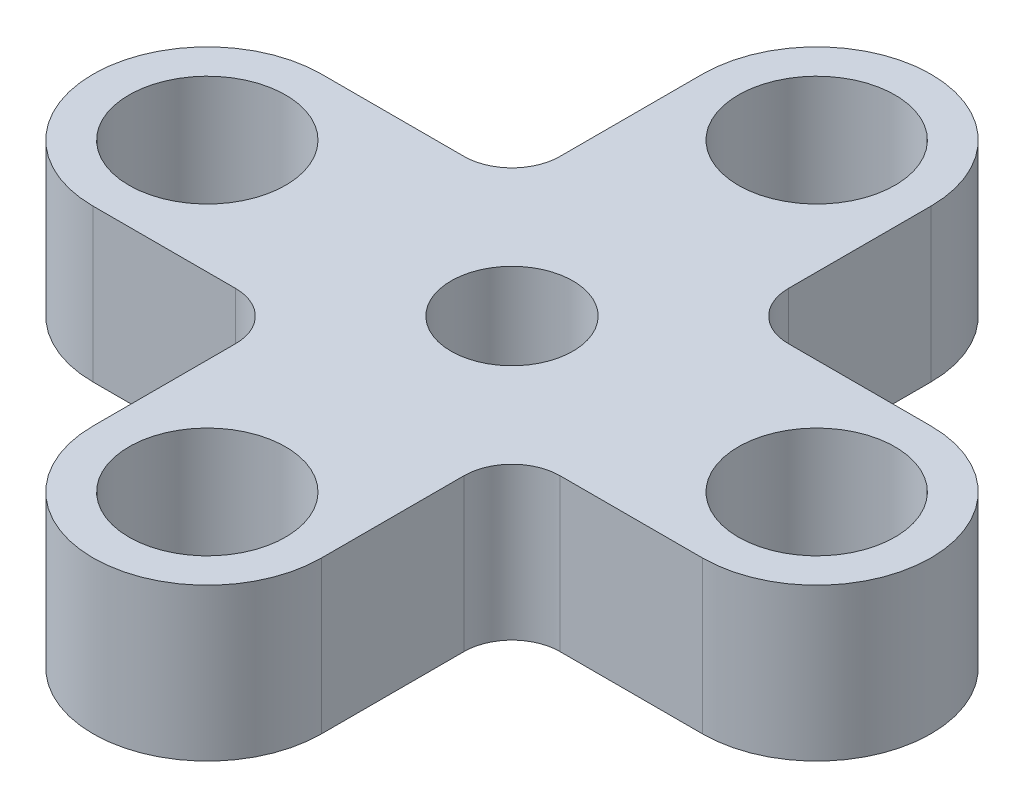
ISO-10303-21;
HEADER;
FILE_DESCRIPTION(('STEP AP214'),'2;1');
FILE_NAME('part.step','',(''),(''),'','','');
FILE_SCHEMA(('AUTOMOTIVE_DESIGN { 1 0 10303 214 1 1 1 1 }'));
ENDSEC;
DATA;
#1=APPLICATION_CONTEXT('core data for automotive mechanical design processes');
#2=APPLICATION_PROTOCOL_DEFINITION('international standard','automotive_design',2000,#1);
#3=PRODUCT_CONTEXT('',#1,'mechanical');
#4=PRODUCT('Part','Part','',(#3));
#5=PRODUCT_RELATED_PRODUCT_CATEGORY('part','',(#4));
#6=PRODUCT_DEFINITION_FORMATION('','',#4);
#7=PRODUCT_DEFINITION_CONTEXT('part definition',#1,'design');
#8=PRODUCT_DEFINITION('design','',#6,#7);
#9=PRODUCT_DEFINITION_SHAPE('','',#8);
#10=(LENGTH_UNIT() NAMED_UNIT(*) SI_UNIT(.MILLI.,.METRE.));
#11=(NAMED_UNIT(*) PLANE_ANGLE_UNIT() SI_UNIT($,.RADIAN.));
#12=(NAMED_UNIT(*) SI_UNIT($,.STERADIAN.) SOLID_ANGLE_UNIT());
#13=UNCERTAINTY_MEASURE_WITH_UNIT(LENGTH_MEASURE(1.E-05),#10,'distance_accuracy_value','');
#14=(GEOMETRIC_REPRESENTATION_CONTEXT(3) GLOBAL_UNCERTAINTY_ASSIGNED_CONTEXT((#13)) GLOBAL_UNIT_ASSIGNED_CONTEXT((#10,
#11,#12)) REPRESENTATION_CONTEXT('',''));
#15=CARTESIAN_POINT('',(0.,0.,0.));
#16=DIRECTION('',(0.,0.,1.));
#17=DIRECTION('',(1.,0.,0.));
#18=AXIS2_PLACEMENT_3D('',#15,#16,#17);
#19=CARTESIAN_POINT('',(0.,6.35,0.));
#20=DIRECTION('',(0.,-1.,0.));
#21=DIRECTION('',(0.,0.,-1.));
#22=AXIS2_PLACEMENT_3D('',#19,#20,#21);
#23=CYLINDRICAL_SURFACE('',#22,2.54);
#24=CARTESIAN_POINT('',(0.,6.35,0.));
#25=DIRECTION('',(0.,1.,0.));
#26=DIRECTION('',(0.,0.,1.));
#27=AXIS2_PLACEMENT_3D('',#24,#25,#26);
#28=CIRCLE('',#27,2.54);
#29=CARTESIAN_POINT('',(0.,6.35,2.54));
#30=VERTEX_POINT('',#29);
#31=EDGE_CURVE('E11',#30,#30,#28,.T.);
#32=ORIENTED_EDGE('',*,*,#31,.T.);
#33=EDGE_LOOP('',(#32));
#34=FACE_BOUND('',#33,.T.);
#35=CARTESIAN_POINT('',(0.,0.,0.));
#36=DIRECTION('',(0.,1.,0.));
#37=DIRECTION('',(0.,0.,1.));
#38=AXIS2_PLACEMENT_3D('',#35,#36,#37);
#39=CIRCLE('',#38,2.54);
#40=CARTESIAN_POINT('',(0.,0.,2.54));
#41=VERTEX_POINT('',#40);
#42=EDGE_CURVE('E42',#41,#41,#39,.T.);
#43=ORIENTED_EDGE('',*,*,#42,.F.);
#44=EDGE_LOOP('',(#43));
#45=FACE_BOUND('',#44,.T.);
#46=ADVANCED_FACE('F38',(#34,#45),#23,.F.);
#47=CARTESIAN_POINT('',(12.7,6.35,0.));
#48=DIRECTION('',(0.,-1.,0.));
#49=DIRECTION('',(0.,0.,-1.));
#50=AXIS2_PLACEMENT_3D('',#47,#48,#49);
#51=CYLINDRICAL_SURFACE('',#50,3.2639);
#52=CARTESIAN_POINT('',(12.7,6.35,0.));
#53=DIRECTION('',(0.,1.,0.));
#54=DIRECTION('',(0.,0.,1.));
#55=AXIS2_PLACEMENT_3D('',#52,#53,#54);
#56=CIRCLE('',#55,3.2639);
#57=CARTESIAN_POINT('',(12.7,6.35,3.2639));
#58=VERTEX_POINT('',#57);
#59=EDGE_CURVE('E47',#58,#58,#56,.T.);
#60=ORIENTED_EDGE('',*,*,#59,.T.);
#61=EDGE_LOOP('',(#60));
#62=FACE_BOUND('',#61,.T.);
#63=CARTESIAN_POINT('',(12.7,0.,0.));
#64=DIRECTION('',(0.,1.,0.));
#65=DIRECTION('',(0.,0.,1.));
#66=AXIS2_PLACEMENT_3D('',#63,#64,#65);
#67=CIRCLE('',#66,3.2639);
#68=CARTESIAN_POINT('',(12.7,0.,3.2639));
#69=VERTEX_POINT('',#68);
#70=EDGE_CURVE('E297',#69,#69,#67,.T.);
#71=ORIENTED_EDGE('',*,*,#70,.F.);
#72=EDGE_LOOP('',(#71));
#73=FACE_BOUND('',#72,.T.);
#74=ADVANCED_FACE('F306',(#62,#73),#51,.F.);
#75=CARTESIAN_POINT('',(0.,6.35,12.7));
#76=DIRECTION('',(0.,-1.,0.));
#77=DIRECTION('',(0.,0.,-1.));
#78=AXIS2_PLACEMENT_3D('',#75,#76,#77);
#79=CYLINDRICAL_SURFACE('',#78,3.2639);
#80=CARTESIAN_POINT('',(0.,6.35,12.7));
#81=DIRECTION('',(0.,1.,0.));
#82=DIRECTION('',(0.,0.,1.));
#83=AXIS2_PLACEMENT_3D('',#80,#81,#82);
#84=CIRCLE('',#83,3.2639);
#85=CARTESIAN_POINT('',(0.,6.35,15.9639));
#86=VERTEX_POINT('',#85);
#87=EDGE_CURVE('E285',#86,#86,#84,.T.);
#88=ORIENTED_EDGE('',*,*,#87,.T.);
#89=EDGE_LOOP('',(#88));
#90=FACE_BOUND('',#89,.T.);
#91=CARTESIAN_POINT('',(0.,0.,12.7));
#92=DIRECTION('',(0.,1.,0.));
#93=DIRECTION('',(0.,0.,1.));
#94=AXIS2_PLACEMENT_3D('',#91,#92,#93);
#95=CIRCLE('',#94,3.2639);
#96=CARTESIAN_POINT('',(0.,0.,15.9639));
#97=VERTEX_POINT('',#96);
#98=EDGE_CURVE('E295',#97,#97,#95,.T.);
#99=ORIENTED_EDGE('',*,*,#98,.F.);
#100=EDGE_LOOP('',(#99));
#101=FACE_BOUND('',#100,.T.);
#102=ADVANCED_FACE('F312',(#90,#101),#79,.F.);
#103=CARTESIAN_POINT('',(-12.7,6.35,0.));
#104=DIRECTION('',(0.,-1.,0.));
#105=DIRECTION('',(0.,0.,-1.));
#106=AXIS2_PLACEMENT_3D('',#103,#104,#105);
#107=CYLINDRICAL_SURFACE('',#106,3.2639);
#108=CARTESIAN_POINT('',(-12.7,6.35,0.));
#109=DIRECTION('',(0.,1.,0.));
#110=DIRECTION('',(0.,0.,1.));
#111=AXIS2_PLACEMENT_3D('',#108,#109,#110);
#112=CIRCLE('',#111,3.2639);
#113=CARTESIAN_POINT('',(-12.7,6.35,3.2639));
#114=VERTEX_POINT('',#113);
#115=EDGE_CURVE('E282',#114,#114,#112,.T.);
#116=ORIENTED_EDGE('',*,*,#115,.T.);
#117=EDGE_LOOP('',(#116));
#118=FACE_BOUND('',#117,.T.);
#119=CARTESIAN_POINT('',(-12.7,0.,0.));
#120=DIRECTION('',(0.,1.,0.));
#121=DIRECTION('',(0.,0.,1.));
#122=AXIS2_PLACEMENT_3D('',#119,#120,#121);
#123=CIRCLE('',#122,3.2639);
#124=CARTESIAN_POINT('',(-12.7,0.,3.2639));
#125=VERTEX_POINT('',#124);
#126=EDGE_CURVE('E292',#125,#125,#123,.T.);
#127=ORIENTED_EDGE('',*,*,#126,.F.);
#128=EDGE_LOOP('',(#127));
#129=FACE_BOUND('',#128,.T.);
#130=ADVANCED_FACE('F319',(#118,#129),#107,.F.);
#131=CARTESIAN_POINT('',(0.,6.35,-12.7));
#132=DIRECTION('',(0.,-1.,0.));
#133=DIRECTION('',(0.,0.,-1.));
#134=AXIS2_PLACEMENT_3D('',#131,#132,#133);
#135=CYLINDRICAL_SURFACE('',#134,3.2639);
#136=CARTESIAN_POINT('',(0.,6.35,-12.7));
#137=DIRECTION('',(0.,1.,0.));
#138=DIRECTION('',(0.,0.,1.));
#139=AXIS2_PLACEMENT_3D('',#136,#137,#138);
#140=CIRCLE('',#139,3.2639);
#141=CARTESIAN_POINT('',(0.,6.35,-9.4361));
#142=VERTEX_POINT('',#141);
#143=EDGE_CURVE('E279',#142,#142,#140,.T.);
#144=ORIENTED_EDGE('',*,*,#143,.T.);
#145=EDGE_LOOP('',(#144));
#146=FACE_BOUND('',#145,.T.);
#147=CARTESIAN_POINT('',(0.,0.,-12.7));
#148=DIRECTION('',(0.,1.,0.));
#149=DIRECTION('',(0.,0.,1.));
#150=AXIS2_PLACEMENT_3D('',#147,#148,#149);
#151=CIRCLE('',#150,3.2639);
#152=CARTESIAN_POINT('',(0.,0.,-9.4361));
#153=VERTEX_POINT('',#152);
#154=EDGE_CURVE('E278',#153,#153,#151,.T.);
#155=ORIENTED_EDGE('',*,*,#154,.F.);
#156=EDGE_LOOP('',(#155));
#157=FACE_BOUND('',#156,.T.);
#158=ADVANCED_FACE('F40',(#146,#157),#135,.F.);
#159=CARTESIAN_POINT('',(0.,6.35,0.));
#160=DIRECTION('',(0.,1.,0.));
#161=DIRECTION('',(0.,0.,1.));
#162=AXIS2_PLACEMENT_3D('',#159,#160,#161);
#163=PLANE('',#162);
#164=CARTESIAN_POINT('',(6.7625,6.35,-6.7625));
#165=DIRECTION('',(0.,1.,0.));
#166=DIRECTION('',(0.,0.,1.));
#167=AXIS2_PLACEMENT_3D('',#164,#165,#166);
#168=CIRCLE('',#167,2.);
#169=CARTESIAN_POINT('',(6.76250000000002,6.35,-4.7625));
#170=VERTEX_POINT('',#169);
#171=CARTESIAN_POINT('',(4.7625,6.35,-6.76250000000001));
#172=VERTEX_POINT('',#171);
#173=EDGE_CURVE('E275',#170,#172,#168,.F.);
#174=ORIENTED_EDGE('',*,*,#173,.T.);
#175=DIRECTION('',(0.,0.,-1.));
#176=VECTOR('',#175,1.);
#177=CARTESIAN_POINT('',(4.76250000000001,6.35,0.));
#178=LINE('',#177,#176);
#179=CARTESIAN_POINT('',(4.7625,6.35,-12.7));
#180=VERTEX_POINT('',#179);
#181=EDGE_CURVE('E156',#172,#180,#178,.T.);
#182=ORIENTED_EDGE('',*,*,#181,.T.);
#183=CARTESIAN_POINT('',(0.,6.35,-12.7));
#184=DIRECTION('',(0.,1.,0.));
#185=DIRECTION('',(0.,0.,1.));
#186=AXIS2_PLACEMENT_3D('',#183,#184,#185);
#187=CIRCLE('',#186,4.7625);
#188=CARTESIAN_POINT('',(-4.7625,6.35,-12.7));
#189=VERTEX_POINT('',#188);
#190=EDGE_CURVE('E159',#189,#180,#187,.F.);
#191=ORIENTED_EDGE('',*,*,#190,.F.);
#192=DIRECTION('',(0.,0.,-1.));
#193=VECTOR('',#192,1.);
#194=CARTESIAN_POINT('',(-4.7625,6.35,0.));
#195=LINE('',#194,#193);
#196=CARTESIAN_POINT('',(-4.7625,6.35,-6.76250000000001));
#197=VERTEX_POINT('',#196);
#198=EDGE_CURVE('E245',#197,#189,#195,.T.);
#199=ORIENTED_EDGE('',*,*,#198,.F.);
#200=CARTESIAN_POINT('',(-6.7625,6.35,-6.7625));
#201=DIRECTION('',(0.,1.,0.));
#202=DIRECTION('',(0.,0.,1.));
#203=AXIS2_PLACEMENT_3D('',#200,#201,#202);
#204=CIRCLE('',#203,2.);
#205=CARTESIAN_POINT('',(-6.76250000000001,6.35,-4.7625));
#206=VERTEX_POINT('',#205);
#207=EDGE_CURVE('E247',#206,#197,#204,.T.);
#208=ORIENTED_EDGE('',*,*,#207,.F.);
#209=DIRECTION('',(1.,0.,0.));
#210=VECTOR('',#209,1.);
#211=CARTESIAN_POINT('',(0.,6.35,-4.76249999999999));
#212=LINE('',#211,#210);
#213=CARTESIAN_POINT('',(-12.7,6.35,-4.7625));
#214=VERTEX_POINT('',#213);
#215=EDGE_CURVE('E249',#214,#206,#212,.T.);
#216=ORIENTED_EDGE('',*,*,#215,.F.);
#217=CARTESIAN_POINT('',(-12.7,6.35,0.));
#218=DIRECTION('',(0.,1.,0.));
#219=DIRECTION('',(0.,0.,1.));
#220=AXIS2_PLACEMENT_3D('',#217,#218,#219);
#221=CIRCLE('',#220,4.7625);
#222=CARTESIAN_POINT('',(-12.7,6.35,4.7625));
#223=VERTEX_POINT('',#222);
#224=EDGE_CURVE('E251',#223,#214,#221,.F.);
#225=ORIENTED_EDGE('',*,*,#224,.F.);
#226=DIRECTION('',(-1.,0.,0.));
#227=VECTOR('',#226,1.);
#228=CARTESIAN_POINT('',(0.,6.35,4.7625));
#229=LINE('',#228,#227);
#230=CARTESIAN_POINT('',(-6.76250000000002,6.35,4.7625));
#231=VERTEX_POINT('',#230);
#232=EDGE_CURVE('E253',#231,#223,#229,.T.);
#233=ORIENTED_EDGE('',*,*,#232,.F.);
#234=CARTESIAN_POINT('',(-6.7625,6.35,6.7625));
#235=DIRECTION('',(0.,1.,0.));
#236=DIRECTION('',(0.,0.,1.));
#237=AXIS2_PLACEMENT_3D('',#234,#235,#236);
#238=CIRCLE('',#237,2.);
#239=CARTESIAN_POINT('',(-4.7625,6.35,6.76250000000002));
#240=VERTEX_POINT('',#239);
#241=EDGE_CURVE('E255',#240,#231,#238,.T.);
#242=ORIENTED_EDGE('',*,*,#241,.F.);
#243=DIRECTION('',(0.,0.,-1.));
#244=VECTOR('',#243,1.);
#245=CARTESIAN_POINT('',(-4.7625,6.35,0.));
#246=LINE('',#245,#244);
#247=CARTESIAN_POINT('',(-4.7625,6.35,12.7));
#248=VERTEX_POINT('',#247);
#249=EDGE_CURVE('E257',#248,#240,#246,.T.);
#250=ORIENTED_EDGE('',*,*,#249,.F.);
#251=CARTESIAN_POINT('',(0.,6.35,12.7));
#252=DIRECTION('',(0.,1.,0.));
#253=DIRECTION('',(0.,0.,1.));
#254=AXIS2_PLACEMENT_3D('',#251,#252,#253);
#255=CIRCLE('',#254,4.7625);
#256=CARTESIAN_POINT('',(4.7625,6.35,12.7));
#257=VERTEX_POINT('',#256);
#258=EDGE_CURVE('E259',#257,#248,#255,.F.);
#259=ORIENTED_EDGE('',*,*,#258,.F.);
#260=DIRECTION('',(0.,0.,-1.));
#261=VECTOR('',#260,1.);
#262=CARTESIAN_POINT('',(4.7625,6.35,0.));
#263=LINE('',#262,#261);
#264=CARTESIAN_POINT('',(4.7625,6.35,6.76250000000001));
#265=VERTEX_POINT('',#264);
#266=EDGE_CURVE('E261',#257,#265,#263,.T.);
#267=ORIENTED_EDGE('',*,*,#266,.T.);
#268=CARTESIAN_POINT('',(6.7625,6.35,6.7625));
#269=DIRECTION('',(0.,1.,0.));
#270=DIRECTION('',(0.,0.,1.));
#271=AXIS2_PLACEMENT_3D('',#268,#269,#270);
#272=CIRCLE('',#271,2.);
#273=CARTESIAN_POINT('',(6.76250000000002,6.35,4.7625));
#274=VERTEX_POINT('',#273);
#275=EDGE_CURVE('E264',#265,#274,#272,.F.);
#276=ORIENTED_EDGE('',*,*,#275,.T.);
#277=DIRECTION('',(1.,0.,0.));
#278=VECTOR('',#277,1.);
#279=CARTESIAN_POINT('',(0.,6.35,4.76249999999999));
#280=LINE('',#279,#278);
#281=CARTESIAN_POINT('',(12.7,6.35,4.7625));
#282=VERTEX_POINT('',#281);
#283=EDGE_CURVE('E267',#274,#282,#280,.T.);
#284=ORIENTED_EDGE('',*,*,#283,.T.);
#285=CARTESIAN_POINT('',(12.7,6.35,0.));
#286=DIRECTION('',(0.,1.,0.));
#287=DIRECTION('',(0.,0.,1.));
#288=AXIS2_PLACEMENT_3D('',#285,#286,#287);
#289=CIRCLE('',#288,4.7625);
#290=CARTESIAN_POINT('',(12.7,6.35,-4.7625));
#291=VERTEX_POINT('',#290);
#292=EDGE_CURVE('E270',#291,#282,#289,.F.);
#293=ORIENTED_EDGE('',*,*,#292,.F.);
#294=DIRECTION('',(-1.,0.,0.));
#295=VECTOR('',#294,1.);
#296=CARTESIAN_POINT('',(0.,6.35,-4.76249999999999));
#297=LINE('',#296,#295);
#298=EDGE_CURVE('E272',#291,#170,#297,.T.);
#299=ORIENTED_EDGE('',*,*,#298,.T.);
#300=EDGE_LOOP('',(#174,#182,#191,#199,#208,#216,#225,#233,#242,#250,#259,#267,#276,#284,#293,#299));
#301=FACE_BOUND('',#300,.T.);
#302=ORIENTED_EDGE('',*,*,#143,.F.);
#303=EDGE_LOOP('',(#302));
#304=FACE_BOUND('',#303,.T.);
#305=ORIENTED_EDGE('',*,*,#115,.F.);
#306=EDGE_LOOP('',(#305));
#307=FACE_BOUND('',#306,.T.);
#308=ORIENTED_EDGE('',*,*,#87,.F.);
#309=EDGE_LOOP('',(#308));
#310=FACE_BOUND('',#309,.T.);
#311=ORIENTED_EDGE('',*,*,#59,.F.);
#312=EDGE_LOOP('',(#311));
#313=FACE_BOUND('',#312,.T.);
#314=ORIENTED_EDGE('',*,*,#31,.F.);
#315=EDGE_LOOP('',(#314));
#316=FACE_BOUND('',#315,.T.);
#317=ADVANCED_FACE('F326',(#301,#304,#307,#310,#313,#316),#163,.T.);
#318=CARTESIAN_POINT('',(0.,0.,0.));
#319=DIRECTION('',(0.,1.,0.));
#320=DIRECTION('',(0.,0.,1.));
#321=AXIS2_PLACEMENT_3D('',#318,#319,#320);
#322=PLANE('',#321);
#323=DIRECTION('',(0.,0.,1.));
#324=VECTOR('',#323,1.);
#325=CARTESIAN_POINT('',(4.76250000000001,0.,0.));
#326=LINE('',#325,#324);
#327=CARTESIAN_POINT('',(4.7625,0.,-12.7));
#328=VERTEX_POINT('',#327);
#329=CARTESIAN_POINT('',(4.7625,0.,-6.76250000000001));
#330=VERTEX_POINT('',#329);
#331=EDGE_CURVE('E63',#328,#330,#326,.T.);
#332=ORIENTED_EDGE('',*,*,#331,.T.);
#333=CARTESIAN_POINT('',(6.7625,0.,-6.7625));
#334=DIRECTION('',(0.,1.,0.));
#335=DIRECTION('',(0.,0.,1.));
#336=AXIS2_PLACEMENT_3D('',#333,#334,#335);
#337=CIRCLE('',#336,2.);
#338=CARTESIAN_POINT('',(6.76250000000002,0.,-4.7625));
#339=VERTEX_POINT('',#338);
#340=EDGE_CURVE('E163',#330,#339,#337,.T.);
#341=ORIENTED_EDGE('',*,*,#340,.T.);
#342=DIRECTION('',(1.,0.,0.));
#343=VECTOR('',#342,1.);
#344=CARTESIAN_POINT('',(0.,0.,-4.76249999999999));
#345=LINE('',#344,#343);
#346=CARTESIAN_POINT('',(12.7,0.,-4.7625));
#347=VERTEX_POINT('',#346);
#348=EDGE_CURVE('E169',#339,#347,#345,.T.);
#349=ORIENTED_EDGE('',*,*,#348,.T.);
#350=CARTESIAN_POINT('',(12.7,0.,0.));
#351=DIRECTION('',(0.,1.,0.));
#352=DIRECTION('',(0.,0.,1.));
#353=AXIS2_PLACEMENT_3D('',#350,#351,#352);
#354=CIRCLE('',#353,4.7625);
#355=CARTESIAN_POINT('',(12.7,0.,4.7625));
#356=VERTEX_POINT('',#355);
#357=EDGE_CURVE('E179',#356,#347,#354,.T.);
#358=ORIENTED_EDGE('',*,*,#357,.F.);
#359=DIRECTION('',(-1.,0.,0.));
#360=VECTOR('',#359,1.);
#361=CARTESIAN_POINT('',(0.,0.,4.76249999999999));
#362=LINE('',#361,#360);
#363=CARTESIAN_POINT('',(6.76250000000002,0.,4.7625));
#364=VERTEX_POINT('',#363);
#365=EDGE_CURVE('E182',#356,#364,#362,.T.);
#366=ORIENTED_EDGE('',*,*,#365,.T.);
#367=CARTESIAN_POINT('',(6.7625,0.,6.7625));
#368=DIRECTION('',(0.,1.,0.));
#369=DIRECTION('',(0.,0.,1.));
#370=AXIS2_PLACEMENT_3D('',#367,#368,#369);
#371=CIRCLE('',#370,2.);
#372=CARTESIAN_POINT('',(4.7625,0.,6.76250000000001));
#373=VERTEX_POINT('',#372);
#374=EDGE_CURVE('E185',#364,#373,#371,.T.);
#375=ORIENTED_EDGE('',*,*,#374,.T.);
#376=DIRECTION('',(0.,0.,1.));
#377=VECTOR('',#376,1.);
#378=CARTESIAN_POINT('',(4.7625,0.,0.));
#379=LINE('',#378,#377);
#380=CARTESIAN_POINT('',(4.7625,0.,12.7));
#381=VERTEX_POINT('',#380);
#382=EDGE_CURVE('E188',#373,#381,#379,.T.);
#383=ORIENTED_EDGE('',*,*,#382,.T.);
#384=CARTESIAN_POINT('',(0.,0.,12.7));
#385=DIRECTION('',(0.,1.,0.));
#386=DIRECTION('',(0.,0.,1.));
#387=AXIS2_PLACEMENT_3D('',#384,#385,#386);
#388=CIRCLE('',#387,4.7625);
#389=CARTESIAN_POINT('',(-4.7625,0.,12.7));
#390=VERTEX_POINT('',#389);
#391=EDGE_CURVE('E191',#390,#381,#388,.T.);
#392=ORIENTED_EDGE('',*,*,#391,.F.);
#393=DIRECTION('',(0.,0.,1.));
#394=VECTOR('',#393,1.);
#395=CARTESIAN_POINT('',(-4.7625,0.,0.));
#396=LINE('',#395,#394);
#397=CARTESIAN_POINT('',(-4.7625,0.,6.76250000000002));
#398=VERTEX_POINT('',#397);
#399=EDGE_CURVE('E194',#398,#390,#396,.T.);
#400=ORIENTED_EDGE('',*,*,#399,.F.);
#401=CARTESIAN_POINT('',(-6.7625,0.,6.7625));
#402=DIRECTION('',(0.,1.,0.));
#403=DIRECTION('',(0.,0.,1.));
#404=AXIS2_PLACEMENT_3D('',#401,#402,#403);
#405=CIRCLE('',#404,2.);
#406=CARTESIAN_POINT('',(-6.76250000000002,0.,4.7625));
#407=VERTEX_POINT('',#406);
#408=EDGE_CURVE('E197',#407,#398,#405,.F.);
#409=ORIENTED_EDGE('',*,*,#408,.F.);
#410=DIRECTION('',(1.,0.,0.));
#411=VECTOR('',#410,1.);
#412=CARTESIAN_POINT('',(0.,0.,4.7625));
#413=LINE('',#412,#411);
#414=CARTESIAN_POINT('',(-12.7,0.,4.7625));
#415=VERTEX_POINT('',#414);
#416=EDGE_CURVE('E200',#415,#407,#413,.T.);
#417=ORIENTED_EDGE('',*,*,#416,.F.);
#418=CARTESIAN_POINT('',(-12.7,0.,0.));
#419=DIRECTION('',(0.,1.,0.));
#420=DIRECTION('',(0.,0.,1.));
#421=AXIS2_PLACEMENT_3D('',#418,#419,#420);
#422=CIRCLE('',#421,4.7625);
#423=CARTESIAN_POINT('',(-12.7,0.,-4.7625));
#424=VERTEX_POINT('',#423);
#425=EDGE_CURVE('E203',#424,#415,#422,.T.);
#426=ORIENTED_EDGE('',*,*,#425,.F.);
#427=DIRECTION('',(-1.,0.,0.));
#428=VECTOR('',#427,1.);
#429=CARTESIAN_POINT('',(0.,0.,-4.76249999999999));
#430=LINE('',#429,#428);
#431=CARTESIAN_POINT('',(-6.76250000000001,0.,-4.7625));
#432=VERTEX_POINT('',#431);
#433=EDGE_CURVE('E206',#432,#424,#430,.T.);
#434=ORIENTED_EDGE('',*,*,#433,.F.);
#435=CARTESIAN_POINT('',(-6.7625,0.,-6.7625));
#436=DIRECTION('',(0.,1.,0.));
#437=DIRECTION('',(0.,0.,1.));
#438=AXIS2_PLACEMENT_3D('',#435,#436,#437);
#439=CIRCLE('',#438,2.);
#440=CARTESIAN_POINT('',(-4.7625,0.,-6.76250000000001));
#441=VERTEX_POINT('',#440);
#442=EDGE_CURVE('E209',#441,#432,#439,.F.);
#443=ORIENTED_EDGE('',*,*,#442,.F.);
#444=DIRECTION('',(0.,0.,1.));
#445=VECTOR('',#444,1.);
#446=CARTESIAN_POINT('',(-4.7625,0.,0.));
#447=LINE('',#446,#445);
#448=CARTESIAN_POINT('',(-4.7625,0.,-12.7));
#449=VERTEX_POINT('',#448);
#450=EDGE_CURVE('E212',#449,#441,#447,.T.);
#451=ORIENTED_EDGE('',*,*,#450,.F.);
#452=CARTESIAN_POINT('',(0.,0.,-12.7));
#453=DIRECTION('',(0.,1.,0.));
#454=DIRECTION('',(0.,0.,1.));
#455=AXIS2_PLACEMENT_3D('',#452,#453,#454);
#456=CIRCLE('',#455,4.7625);
#457=EDGE_CURVE('E175',#328,#449,#456,.T.);
#458=ORIENTED_EDGE('',*,*,#457,.F.);
#459=EDGE_LOOP('',(#332,#341,#349,#358,#366,#375,#383,#392,#400,#409,#417,#426,#434,#443,#451,#458));
#460=FACE_BOUND('',#459,.T.);
#461=ORIENTED_EDGE('',*,*,#154,.T.);
#462=EDGE_LOOP('',(#461));
#463=FACE_BOUND('',#462,.T.);
#464=ORIENTED_EDGE('',*,*,#126,.T.);
#465=EDGE_LOOP('',(#464));
#466=FACE_BOUND('',#465,.T.);
#467=ORIENTED_EDGE('',*,*,#98,.T.);
#468=EDGE_LOOP('',(#467));
#469=FACE_BOUND('',#468,.T.);
#470=ORIENTED_EDGE('',*,*,#70,.T.);
#471=EDGE_LOOP('',(#470));
#472=FACE_BOUND('',#471,.T.);
#473=ORIENTED_EDGE('',*,*,#42,.T.);
#474=EDGE_LOOP('',(#473));
#475=FACE_BOUND('',#474,.T.);
#476=ADVANCED_FACE('F172',(#460,#463,#466,#469,#472,#475),#322,.F.);
#477=CARTESIAN_POINT('',(4.76250000000001,10.,0.));
#478=DIRECTION('',(1.,0.,0.));
#479=DIRECTION('',(0.,0.,-1.));
#480=AXIS2_PLACEMENT_3D('',#477,#478,#479);
#481=PLANE('',#480);
#482=DIRECTION('',(0.,-1.,0.));
#483=VECTOR('',#482,1.);
#484=CARTESIAN_POINT('',(4.7625,10.,-6.76250000000001));
#485=LINE('',#484,#483);
#486=EDGE_CURVE('E152',#172,#330,#485,.T.);
#487=ORIENTED_EDGE('',*,*,#486,.T.);
#488=ORIENTED_EDGE('',*,*,#331,.F.);
#489=DIRECTION('',(0.,-1.,0.));
#490=VECTOR('',#489,1.);
#491=CARTESIAN_POINT('',(4.7625,10.,-12.7));
#492=LINE('',#491,#490);
#493=EDGE_CURVE('E216',#180,#328,#492,.T.);
#494=ORIENTED_EDGE('',*,*,#493,.F.);
#495=ORIENTED_EDGE('',*,*,#181,.F.);
#496=EDGE_LOOP('',(#487,#488,#494,#495));
#497=FACE_BOUND('',#496,.T.);
#498=ADVANCED_FACE('F154',(#497),#481,.T.);
#499=CARTESIAN_POINT('',(6.7625,10.,-6.7625));
#500=DIRECTION('',(0.,-1.,0.));
#501=DIRECTION('',(0.,0.,-1.));
#502=AXIS2_PLACEMENT_3D('',#499,#500,#501);
#503=CYLINDRICAL_SURFACE('',#502,2.);
#504=DIRECTION('',(0.,-1.,0.));
#505=VECTOR('',#504,1.);
#506=CARTESIAN_POINT('',(6.76250000000002,10.,-4.7625));
#507=LINE('',#506,#505);
#508=EDGE_CURVE('E160',#170,#339,#507,.T.);
#509=ORIENTED_EDGE('',*,*,#508,.T.);
#510=ORIENTED_EDGE('',*,*,#340,.F.);
#511=ORIENTED_EDGE('',*,*,#486,.F.);
#512=ORIENTED_EDGE('',*,*,#173,.F.);
#513=EDGE_LOOP('',(#509,#510,#511,#512));
#514=FACE_BOUND('',#513,.T.);
#515=ADVANCED_FACE('F164',(#514),#503,.F.);
#516=CARTESIAN_POINT('',(0.,10.,-4.76249999999999));
#517=DIRECTION('',(0.,0.,-1.));
#518=DIRECTION('',(-1.,0.,0.));
#519=AXIS2_PLACEMENT_3D('',#516,#517,#518);
#520=PLANE('',#519);
#521=DIRECTION('',(0.,-1.,0.));
#522=VECTOR('',#521,1.);
#523=CARTESIAN_POINT('',(12.7,10.,-4.7625));
#524=LINE('',#523,#522);
#525=EDGE_CURVE('E241',#291,#347,#524,.T.);
#526=ORIENTED_EDGE('',*,*,#525,.T.);
#527=ORIENTED_EDGE('',*,*,#348,.F.);
#528=ORIENTED_EDGE('',*,*,#508,.F.);
#529=ORIENTED_EDGE('',*,*,#298,.F.);
#530=EDGE_LOOP('',(#526,#527,#528,#529));
#531=FACE_BOUND('',#530,.T.);
#532=ADVANCED_FACE('F348',(#531),#520,.T.);
#533=CARTESIAN_POINT('',(12.7,10.,0.));
#534=DIRECTION('',(0.,-1.,0.));
#535=DIRECTION('',(0.,0.,-1.));
#536=AXIS2_PLACEMENT_3D('',#533,#534,#535);
#537=CYLINDRICAL_SURFACE('',#536,4.7625);
#538=ORIENTED_EDGE('',*,*,#292,.T.);
#539=DIRECTION('',(0.,-1.,0.));
#540=VECTOR('',#539,1.);
#541=CARTESIAN_POINT('',(12.7,10.,4.7625));
#542=LINE('',#541,#540);
#543=EDGE_CURVE('E239',#282,#356,#542,.T.);
#544=ORIENTED_EDGE('',*,*,#543,.T.);
#545=ORIENTED_EDGE('',*,*,#357,.T.);
#546=ORIENTED_EDGE('',*,*,#525,.F.);
#547=EDGE_LOOP('',(#538,#544,#545,#546));
#548=FACE_BOUND('',#547,.T.);
#549=ADVANCED_FACE('F351',(#548),#537,.T.);
#550=CARTESIAN_POINT('',(0.,10.,4.76249999999999));
#551=DIRECTION('',(0.,0.,1.));
#552=DIRECTION('',(1.,0.,0.));
#553=AXIS2_PLACEMENT_3D('',#550,#551,#552);
#554=PLANE('',#553);
#555=DIRECTION('',(0.,-1.,0.));
#556=VECTOR('',#555,1.);
#557=CARTESIAN_POINT('',(6.76250000000002,10.,4.7625));
#558=LINE('',#557,#556);
#559=EDGE_CURVE('E237',#274,#364,#558,.T.);
#560=ORIENTED_EDGE('',*,*,#559,.T.);
#561=ORIENTED_EDGE('',*,*,#365,.F.);
#562=ORIENTED_EDGE('',*,*,#543,.F.);
#563=ORIENTED_EDGE('',*,*,#283,.F.);
#564=EDGE_LOOP('',(#560,#561,#562,#563));
#565=FACE_BOUND('',#564,.T.);
#566=ADVANCED_FACE('F355',(#565),#554,.T.);
#567=CARTESIAN_POINT('',(6.7625,10.,6.7625));
#568=DIRECTION('',(0.,-1.,0.));
#569=DIRECTION('',(0.,0.,-1.));
#570=AXIS2_PLACEMENT_3D('',#567,#568,#569);
#571=CYLINDRICAL_SURFACE('',#570,2.);
#572=DIRECTION('',(0.,-1.,0.));
#573=VECTOR('',#572,1.);
#574=CARTESIAN_POINT('',(4.7625,10.,6.76250000000001));
#575=LINE('',#574,#573);
#576=EDGE_CURVE('E235',#265,#373,#575,.T.);
#577=ORIENTED_EDGE('',*,*,#576,.T.);
#578=ORIENTED_EDGE('',*,*,#374,.F.);
#579=ORIENTED_EDGE('',*,*,#559,.F.);
#580=ORIENTED_EDGE('',*,*,#275,.F.);
#581=EDGE_LOOP('',(#577,#578,#579,#580));
#582=FACE_BOUND('',#581,.T.);
#583=ADVANCED_FACE('F359',(#582),#571,.F.);
#584=CARTESIAN_POINT('',(4.7625,10.,0.));
#585=DIRECTION('',(1.,0.,0.));
#586=DIRECTION('',(0.,0.,-1.));
#587=AXIS2_PLACEMENT_3D('',#584,#585,#586);
#588=PLANE('',#587);
#589=DIRECTION('',(0.,-1.,0.));
#590=VECTOR('',#589,1.);
#591=CARTESIAN_POINT('',(4.7625,10.,12.7));
#592=LINE('',#591,#590);
#593=EDGE_CURVE('E233',#257,#381,#592,.T.);
#594=ORIENTED_EDGE('',*,*,#593,.T.);
#595=ORIENTED_EDGE('',*,*,#382,.F.);
#596=ORIENTED_EDGE('',*,*,#576,.F.);
#597=ORIENTED_EDGE('',*,*,#266,.F.);
#598=EDGE_LOOP('',(#594,#595,#596,#597));
#599=FACE_BOUND('',#598,.T.);
#600=ADVANCED_FACE('F363',(#599),#588,.T.);
#601=CARTESIAN_POINT('',(0.,10.,12.7));
#602=DIRECTION('',(0.,-1.,0.));
#603=DIRECTION('',(0.,0.,-1.));
#604=AXIS2_PLACEMENT_3D('',#601,#602,#603);
#605=CYLINDRICAL_SURFACE('',#604,4.7625);
#606=ORIENTED_EDGE('',*,*,#258,.T.);
#607=DIRECTION('',(0.,-1.,0.));
#608=VECTOR('',#607,1.);
#609=CARTESIAN_POINT('',(-4.7625,10.,12.7));
#610=LINE('',#609,#608);
#611=EDGE_CURVE('E231',#248,#390,#610,.T.);
#612=ORIENTED_EDGE('',*,*,#611,.T.);
#613=ORIENTED_EDGE('',*,*,#391,.T.);
#614=ORIENTED_EDGE('',*,*,#593,.F.);
#615=EDGE_LOOP('',(#606,#612,#613,#614));
#616=FACE_BOUND('',#615,.T.);
#617=ADVANCED_FACE('F367',(#616),#605,.T.);
#618=CARTESIAN_POINT('',(-4.7625,10.,0.));
#619=DIRECTION('',(1.,0.,0.));
#620=DIRECTION('',(0.,0.,-1.));
#621=AXIS2_PLACEMENT_3D('',#618,#619,#620);
#622=PLANE('',#621);
#623=ORIENTED_EDGE('',*,*,#249,.T.);
#624=DIRECTION('',(0.,-1.,0.));
#625=VECTOR('',#624,1.);
#626=CARTESIAN_POINT('',(-4.7625,10.,6.76250000000002));
#627=LINE('',#626,#625);
#628=EDGE_CURVE('E229',#240,#398,#627,.T.);
#629=ORIENTED_EDGE('',*,*,#628,.T.);
#630=ORIENTED_EDGE('',*,*,#399,.T.);
#631=ORIENTED_EDGE('',*,*,#611,.F.);
#632=EDGE_LOOP('',(#623,#629,#630,#631));
#633=FACE_BOUND('',#632,.T.);
#634=ADVANCED_FACE('F371',(#633),#622,.F.);
#635=CARTESIAN_POINT('',(-6.7625,10.,6.7625));
#636=DIRECTION('',(0.,-1.,0.));
#637=DIRECTION('',(0.,0.,-1.));
#638=AXIS2_PLACEMENT_3D('',#635,#636,#637);
#639=CYLINDRICAL_SURFACE('',#638,2.);
#640=ORIENTED_EDGE('',*,*,#241,.T.);
#641=DIRECTION('',(0.,-1.,0.));
#642=VECTOR('',#641,1.);
#643=CARTESIAN_POINT('',(-6.76250000000002,10.,4.7625));
#644=LINE('',#643,#642);
#645=EDGE_CURVE('E227',#231,#407,#644,.T.);
#646=ORIENTED_EDGE('',*,*,#645,.T.);
#647=ORIENTED_EDGE('',*,*,#408,.T.);
#648=ORIENTED_EDGE('',*,*,#628,.F.);
#649=EDGE_LOOP('',(#640,#646,#647,#648));
#650=FACE_BOUND('',#649,.T.);
#651=ADVANCED_FACE('F375',(#650),#639,.F.);
#652=CARTESIAN_POINT('',(0.,10.,4.7625));
#653=DIRECTION('',(0.,0.,-1.));
#654=DIRECTION('',(-1.,0.,0.));
#655=AXIS2_PLACEMENT_3D('',#652,#653,#654);
#656=PLANE('',#655);
#657=ORIENTED_EDGE('',*,*,#232,.T.);
#658=DIRECTION('',(0.,-1.,0.));
#659=VECTOR('',#658,1.);
#660=CARTESIAN_POINT('',(-12.7,10.,4.7625));
#661=LINE('',#660,#659);
#662=EDGE_CURVE('E225',#223,#415,#661,.T.);
#663=ORIENTED_EDGE('',*,*,#662,.T.);
#664=ORIENTED_EDGE('',*,*,#416,.T.);
#665=ORIENTED_EDGE('',*,*,#645,.F.);
#666=EDGE_LOOP('',(#657,#663,#664,#665));
#667=FACE_BOUND('',#666,.T.);
#668=ADVANCED_FACE('F379',(#667),#656,.F.);
#669=CARTESIAN_POINT('',(-12.7,10.,0.));
#670=DIRECTION('',(0.,-1.,0.));
#671=DIRECTION('',(0.,0.,-1.));
#672=AXIS2_PLACEMENT_3D('',#669,#670,#671);
#673=CYLINDRICAL_SURFACE('',#672,4.7625);
#674=ORIENTED_EDGE('',*,*,#224,.T.);
#675=DIRECTION('',(0.,-1.,0.));
#676=VECTOR('',#675,1.);
#677=CARTESIAN_POINT('',(-12.7,10.,-4.7625));
#678=LINE('',#677,#676);
#679=EDGE_CURVE('E223',#214,#424,#678,.T.);
#680=ORIENTED_EDGE('',*,*,#679,.T.);
#681=ORIENTED_EDGE('',*,*,#425,.T.);
#682=ORIENTED_EDGE('',*,*,#662,.F.);
#683=EDGE_LOOP('',(#674,#680,#681,#682));
#684=FACE_BOUND('',#683,.T.);
#685=ADVANCED_FACE('F383',(#684),#673,.T.);
#686=CARTESIAN_POINT('',(0.,10.,-4.76249999999999));
#687=DIRECTION('',(0.,0.,1.));
#688=DIRECTION('',(1.,0.,0.));
#689=AXIS2_PLACEMENT_3D('',#686,#687,#688);
#690=PLANE('',#689);
#691=ORIENTED_EDGE('',*,*,#215,.T.);
#692=DIRECTION('',(0.,-1.,0.));
#693=VECTOR('',#692,1.);
#694=CARTESIAN_POINT('',(-6.76250000000001,10.,-4.7625));
#695=LINE('',#694,#693);
#696=EDGE_CURVE('E221',#206,#432,#695,.T.);
#697=ORIENTED_EDGE('',*,*,#696,.T.);
#698=ORIENTED_EDGE('',*,*,#433,.T.);
#699=ORIENTED_EDGE('',*,*,#679,.F.);
#700=EDGE_LOOP('',(#691,#697,#698,#699));
#701=FACE_BOUND('',#700,.T.);
#702=ADVANCED_FACE('F387',(#701),#690,.F.);
#703=CARTESIAN_POINT('',(-6.7625,10.,-6.7625));
#704=DIRECTION('',(0.,-1.,0.));
#705=DIRECTION('',(0.,0.,-1.));
#706=AXIS2_PLACEMENT_3D('',#703,#704,#705);
#707=CYLINDRICAL_SURFACE('',#706,2.);
#708=ORIENTED_EDGE('',*,*,#207,.T.);
#709=DIRECTION('',(0.,-1.,0.));
#710=VECTOR('',#709,1.);
#711=CARTESIAN_POINT('',(-4.7625,10.,-6.76250000000001));
#712=LINE('',#711,#710);
#713=EDGE_CURVE('E219',#197,#441,#712,.T.);
#714=ORIENTED_EDGE('',*,*,#713,.T.);
#715=ORIENTED_EDGE('',*,*,#442,.T.);
#716=ORIENTED_EDGE('',*,*,#696,.F.);
#717=EDGE_LOOP('',(#708,#714,#715,#716));
#718=FACE_BOUND('',#717,.T.);
#719=ADVANCED_FACE('F391',(#718),#707,.F.);
#720=CARTESIAN_POINT('',(-4.7625,10.,0.));
#721=DIRECTION('',(1.,0.,0.));
#722=DIRECTION('',(0.,0.,-1.));
#723=AXIS2_PLACEMENT_3D('',#720,#721,#722);
#724=PLANE('',#723);
#725=ORIENTED_EDGE('',*,*,#198,.T.);
#726=DIRECTION('',(0.,-1.,0.));
#727=VECTOR('',#726,1.);
#728=CARTESIAN_POINT('',(-4.7625,10.,-12.7));
#729=LINE('',#728,#727);
#730=EDGE_CURVE('E55',#189,#449,#729,.T.);
#731=ORIENTED_EDGE('',*,*,#730,.T.);
#732=ORIENTED_EDGE('',*,*,#450,.T.);
#733=ORIENTED_EDGE('',*,*,#713,.F.);
#734=EDGE_LOOP('',(#725,#731,#732,#733));
#735=FACE_BOUND('',#734,.T.);
#736=ADVANCED_FACE('F395',(#735),#724,.F.);
#737=CARTESIAN_POINT('',(0.,10.,-12.7));
#738=DIRECTION('',(0.,-1.,0.));
#739=DIRECTION('',(0.,0.,-1.));
#740=AXIS2_PLACEMENT_3D('',#737,#738,#739);
#741=CYLINDRICAL_SURFACE('',#740,4.7625);
#742=ORIENTED_EDGE('',*,*,#190,.T.);
#743=ORIENTED_EDGE('',*,*,#493,.T.);
#744=ORIENTED_EDGE('',*,*,#457,.T.);
#745=ORIENTED_EDGE('',*,*,#730,.F.);
#746=EDGE_LOOP('',(#742,#743,#744,#745));
#747=FACE_BOUND('',#746,.T.);
#748=ADVANCED_FACE('F399',(#747),#741,.T.);
#749=CLOSED_SHELL('',(#46,#74,#102,#130,#158,#317,#476,#498,#515,#532,#549,#566,#583,#600,#617,
#634,#651,#668,#685,#702,#719,#736,#748));
#750=MANIFOLD_SOLID_BREP('B2',#749);
#751=ADVANCED_BREP_SHAPE_REPRESENTATION('',(#18,#750),#14);
#752=SHAPE_DEFINITION_REPRESENTATION(#9,#751);
ENDSEC;
END-ISO-10303-21;
